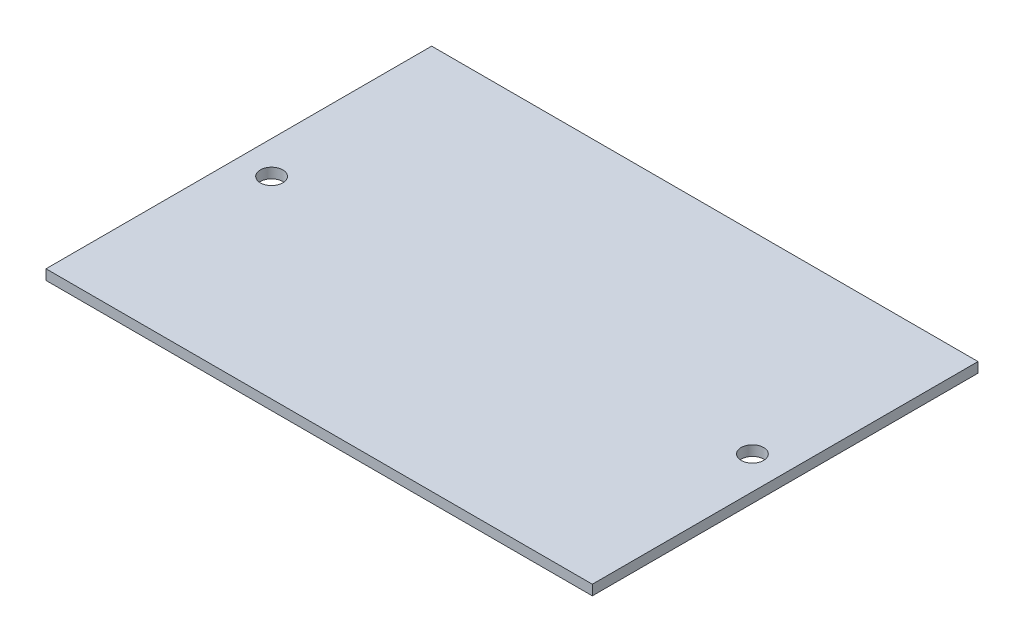
ISO-10303-21;
HEADER;
FILE_DESCRIPTION(('STEP AP214'),'2;1');
FILE_NAME('part.step','',(''),(''),'','','');
FILE_SCHEMA(('AUTOMOTIVE_DESIGN { 1 0 10303 214 1 1 1 1 }'));
ENDSEC;
DATA;
#1=APPLICATION_CONTEXT('core data for automotive mechanical design processes');
#2=APPLICATION_PROTOCOL_DEFINITION('international standard','automotive_design',2000,#1);
#3=PRODUCT_CONTEXT('',#1,'mechanical');
#4=PRODUCT('Part','Part','',(#3));
#5=PRODUCT_RELATED_PRODUCT_CATEGORY('part','',(#4));
#6=PRODUCT_DEFINITION_FORMATION('','',#4);
#7=PRODUCT_DEFINITION_CONTEXT('part definition',#1,'design');
#8=PRODUCT_DEFINITION('design','',#6,#7);
#9=PRODUCT_DEFINITION_SHAPE('','',#8);
#10=(LENGTH_UNIT() NAMED_UNIT(*) SI_UNIT(.MILLI.,.METRE.));
#11=(NAMED_UNIT(*) PLANE_ANGLE_UNIT() SI_UNIT($,.RADIAN.));
#12=(NAMED_UNIT(*) SI_UNIT($,.STERADIAN.) SOLID_ANGLE_UNIT());
#13=UNCERTAINTY_MEASURE_WITH_UNIT(LENGTH_MEASURE(1.E-05),#10,'distance_accuracy_value','');
#14=(GEOMETRIC_REPRESENTATION_CONTEXT(3) GLOBAL_UNCERTAINTY_ASSIGNED_CONTEXT((#13)) GLOBAL_UNIT_ASSIGNED_CONTEXT((#10,
#11,#12)) REPRESENTATION_CONTEXT('',''));
#15=CARTESIAN_POINT('',(0.,0.,0.));
#16=DIRECTION('',(0.,0.,1.));
#17=DIRECTION('',(1.,0.,0.));
#18=AXIS2_PLACEMENT_3D('',#15,#16,#17);
#19=CARTESIAN_POINT('',(43.18,1.6,-30.48));
#20=DIRECTION('',(-1.,0.,0.));
#21=DIRECTION('',(0.,0.,1.));
#22=AXIS2_PLACEMENT_3D('',#19,#20,#21);
#23=PLANE('',#22);
#24=DIRECTION('',(0.,0.,-1.));
#25=VECTOR('',#24,1.);
#26=CARTESIAN_POINT('',(43.18,0.,-30.48));
#27=LINE('',#26,#25);
#28=CARTESIAN_POINT('',(43.18,0.,30.48));
#29=VERTEX_POINT('',#28);
#30=CARTESIAN_POINT('',(43.18,0.,-30.48));
#31=VERTEX_POINT('',#30);
#32=EDGE_CURVE('E95',#29,#31,#27,.T.);
#33=ORIENTED_EDGE('',*,*,#32,.T.);
#34=DIRECTION('',(0.,-1.,0.));
#35=VECTOR('',#34,1.);
#36=CARTESIAN_POINT('',(43.18,1.6,-30.48));
#37=LINE('',#36,#35);
#38=CARTESIAN_POINT('',(43.18,1.6,-30.48));
#39=VERTEX_POINT('',#38);
#40=EDGE_CURVE('E11',#39,#31,#37,.T.);
#41=ORIENTED_EDGE('',*,*,#40,.F.);
#42=DIRECTION('',(0.,0.,-1.));
#43=VECTOR('',#42,1.);
#44=CARTESIAN_POINT('',(43.18,1.6,-30.48));
#45=LINE('',#44,#43);
#46=CARTESIAN_POINT('',(43.18,1.6,30.48));
#47=VERTEX_POINT('',#46);
#48=EDGE_CURVE('E83',#47,#39,#45,.T.);
#49=ORIENTED_EDGE('',*,*,#48,.F.);
#50=DIRECTION('',(0.,-1.,0.));
#51=VECTOR('',#50,1.);
#52=CARTESIAN_POINT('',(43.18,1.6,30.48));
#53=LINE('',#52,#51);
#54=EDGE_CURVE('E91',#47,#29,#53,.T.);
#55=ORIENTED_EDGE('',*,*,#54,.T.);
#56=EDGE_LOOP('',(#33,#41,#49,#55));
#57=FACE_BOUND('',#56,.T.);
#58=ADVANCED_FACE('F32',(#57),#23,.F.);
#59=CARTESIAN_POINT('',(-43.18,1.6,-30.48));
#60=DIRECTION('',(0.,0.,1.));
#61=DIRECTION('',(1.,0.,0.));
#62=AXIS2_PLACEMENT_3D('',#59,#60,#61);
#63=PLANE('',#62);
#64=DIRECTION('',(-1.,0.,0.));
#65=VECTOR('',#64,1.);
#66=CARTESIAN_POINT('',(-43.18,0.,-30.48));
#67=LINE('',#66,#65);
#68=CARTESIAN_POINT('',(-43.18,0.,-30.48));
#69=VERTEX_POINT('',#68);
#70=EDGE_CURVE('E87',#31,#69,#67,.T.);
#71=ORIENTED_EDGE('',*,*,#70,.T.);
#72=DIRECTION('',(0.,-1.,0.));
#73=VECTOR('',#72,1.);
#74=CARTESIAN_POINT('',(-43.18,1.6,-30.48));
#75=LINE('',#74,#73);
#76=CARTESIAN_POINT('',(-43.18,1.6,-30.48));
#77=VERTEX_POINT('',#76);
#78=EDGE_CURVE('E40',#77,#69,#75,.T.);
#79=ORIENTED_EDGE('',*,*,#78,.F.);
#80=DIRECTION('',(-1.,0.,0.));
#81=VECTOR('',#80,1.);
#82=CARTESIAN_POINT('',(-43.18,1.6,-30.48));
#83=LINE('',#82,#81);
#84=EDGE_CURVE('E78',#39,#77,#83,.T.);
#85=ORIENTED_EDGE('',*,*,#84,.F.);
#86=ORIENTED_EDGE('',*,*,#40,.T.);
#87=EDGE_LOOP('',(#71,#79,#85,#86));
#88=FACE_BOUND('',#87,.T.);
#89=ADVANCED_FACE('F86',(#88),#63,.F.);
#90=CARTESIAN_POINT('',(-43.18,1.6,-30.48));
#91=DIRECTION('',(1.,0.,0.));
#92=DIRECTION('',(0.,0.,-1.));
#93=AXIS2_PLACEMENT_3D('',#90,#91,#92);
#94=PLANE('',#93);
#95=DIRECTION('',(0.,0.,1.));
#96=VECTOR('',#95,1.);
#97=CARTESIAN_POINT('',(-43.18,0.,-30.48));
#98=LINE('',#97,#96);
#99=CARTESIAN_POINT('',(-43.18,0.,30.48));
#100=VERTEX_POINT('',#99);
#101=EDGE_CURVE('E65',#69,#100,#98,.T.);
#102=ORIENTED_EDGE('',*,*,#101,.T.);
#103=DIRECTION('',(0.,-1.,0.));
#104=VECTOR('',#103,1.);
#105=CARTESIAN_POINT('',(-43.18,1.6,30.48));
#106=LINE('',#105,#104);
#107=CARTESIAN_POINT('',(-43.18,1.6,30.48));
#108=VERTEX_POINT('',#107);
#109=EDGE_CURVE('E88',#108,#100,#106,.T.);
#110=ORIENTED_EDGE('',*,*,#109,.F.);
#111=DIRECTION('',(0.,0.,1.));
#112=VECTOR('',#111,1.);
#113=CARTESIAN_POINT('',(-43.18,1.6,-30.48));
#114=LINE('',#113,#112);
#115=EDGE_CURVE('E81',#77,#108,#114,.T.);
#116=ORIENTED_EDGE('',*,*,#115,.F.);
#117=ORIENTED_EDGE('',*,*,#78,.T.);
#118=EDGE_LOOP('',(#102,#110,#116,#117));
#119=FACE_BOUND('',#118,.T.);
#120=ADVANCED_FACE('F89',(#119),#94,.F.);
#121=CARTESIAN_POINT('',(-43.18,1.6,30.48));
#122=DIRECTION('',(0.,0.,-1.));
#123=DIRECTION('',(-1.,0.,0.));
#124=AXIS2_PLACEMENT_3D('',#121,#122,#123);
#125=PLANE('',#124);
#126=DIRECTION('',(1.,0.,0.));
#127=VECTOR('',#126,1.);
#128=CARTESIAN_POINT('',(-43.18,0.,30.48));
#129=LINE('',#128,#127);
#130=EDGE_CURVE('E71',#100,#29,#129,.T.);
#131=ORIENTED_EDGE('',*,*,#130,.T.);
#132=ORIENTED_EDGE('',*,*,#54,.F.);
#133=DIRECTION('',(1.,0.,0.));
#134=VECTOR('',#133,1.);
#135=CARTESIAN_POINT('',(-43.18,1.6,30.48));
#136=LINE('',#135,#134);
#137=EDGE_CURVE('E48',#108,#47,#136,.T.);
#138=ORIENTED_EDGE('',*,*,#137,.F.);
#139=ORIENTED_EDGE('',*,*,#109,.T.);
#140=EDGE_LOOP('',(#131,#132,#138,#139));
#141=FACE_BOUND('',#140,.T.);
#142=ADVANCED_FACE('F103',(#141),#125,.F.);
#143=CARTESIAN_POINT('',(0.,1.6,0.));
#144=DIRECTION('',(0.,1.,0.));
#145=DIRECTION('',(0.,0.,1.));
#146=AXIS2_PLACEMENT_3D('',#143,#144,#145);
#147=PLANE('',#146);
#148=CARTESIAN_POINT('',(-38.,1.6,0.));
#149=DIRECTION('',(0.,1.,0.));
#150=DIRECTION('',(0.,0.,1.));
#151=AXIS2_PLACEMENT_3D('',#148,#149,#150);
#152=CIRCLE('',#151,1.778);
#153=CARTESIAN_POINT('',(-38.,1.6,1.778));
#154=VERTEX_POINT('',#153);
#155=EDGE_CURVE('E112',#154,#154,#152,.T.);
#156=ORIENTED_EDGE('',*,*,#155,.F.);
#157=EDGE_LOOP('',(#156));
#158=FACE_BOUND('',#157,.T.);
#159=CARTESIAN_POINT('',(38.,1.6,0.));
#160=DIRECTION('',(0.,1.,0.));
#161=DIRECTION('',(0.,0.,1.));
#162=AXIS2_PLACEMENT_3D('',#159,#160,#161);
#163=CIRCLE('',#162,1.778);
#164=CARTESIAN_POINT('',(38.,1.6,1.77799999999999));
#165=VERTEX_POINT('',#164);
#166=EDGE_CURVE('E113',#165,#165,#163,.T.);
#167=ORIENTED_EDGE('',*,*,#166,.F.);
#168=EDGE_LOOP('',(#167));
#169=FACE_BOUND('',#168,.T.);
#170=ORIENTED_EDGE('',*,*,#48,.T.);
#171=ORIENTED_EDGE('',*,*,#84,.T.);
#172=ORIENTED_EDGE('',*,*,#115,.T.);
#173=ORIENTED_EDGE('',*,*,#137,.T.);
#174=EDGE_LOOP('',(#170,#171,#172,#173));
#175=FACE_BOUND('',#174,.T.);
#176=ADVANCED_FACE('F79',(#158,#169,#175),#147,.T.);
#177=CARTESIAN_POINT('',(0.,0.,0.));
#178=DIRECTION('',(0.,1.,0.));
#179=DIRECTION('',(0.,0.,1.));
#180=AXIS2_PLACEMENT_3D('',#177,#178,#179);
#181=PLANE('',#180);
#182=CARTESIAN_POINT('',(-38.,0.,0.));
#183=DIRECTION('',(0.,1.,0.));
#184=DIRECTION('',(0.,0.,1.));
#185=AXIS2_PLACEMENT_3D('',#182,#183,#184);
#186=CIRCLE('',#185,1.778);
#187=CARTESIAN_POINT('',(-38.,0.,1.778));
#188=VERTEX_POINT('',#187);
#189=EDGE_CURVE('E98',#188,#188,#186,.F.);
#190=ORIENTED_EDGE('',*,*,#189,.F.);
#191=EDGE_LOOP('',(#190));
#192=FACE_BOUND('',#191,.T.);
#193=CARTESIAN_POINT('',(38.,0.,0.));
#194=DIRECTION('',(0.,1.,0.));
#195=DIRECTION('',(0.,0.,1.));
#196=AXIS2_PLACEMENT_3D('',#193,#194,#195);
#197=CIRCLE('',#196,1.778);
#198=CARTESIAN_POINT('',(38.,0.,1.77799999999999));
#199=VERTEX_POINT('',#198);
#200=EDGE_CURVE('E109',#199,#199,#197,.F.);
#201=ORIENTED_EDGE('',*,*,#200,.F.);
#202=EDGE_LOOP('',(#201));
#203=FACE_BOUND('',#202,.T.);
#204=ORIENTED_EDGE('',*,*,#32,.F.);
#205=ORIENTED_EDGE('',*,*,#130,.F.);
#206=ORIENTED_EDGE('',*,*,#101,.F.);
#207=ORIENTED_EDGE('',*,*,#70,.F.);
#208=EDGE_LOOP('',(#204,#205,#206,#207));
#209=FACE_BOUND('',#208,.T.);
#210=ADVANCED_FACE('F106',(#192,#203,#209),#181,.F.);
#211=CARTESIAN_POINT('',(38.,-0.000999999999999916,0.));
#212=DIRECTION('',(0.,1.,0.));
#213=DIRECTION('',(0.,0.,1.));
#214=AXIS2_PLACEMENT_3D('',#211,#212,#213);
#215=CYLINDRICAL_SURFACE('',#214,1.778);
#216=ORIENTED_EDGE('',*,*,#166,.T.);
#217=EDGE_LOOP('',(#216));
#218=FACE_BOUND('',#217,.T.);
#219=ORIENTED_EDGE('',*,*,#200,.T.);
#220=EDGE_LOOP('',(#219));
#221=FACE_BOUND('',#220,.T.);
#222=ADVANCED_FACE('F129',(#218,#221),#215,.F.);
#223=CARTESIAN_POINT('',(-38.,-0.000999999999999916,0.));
#224=DIRECTION('',(0.,1.,0.));
#225=DIRECTION('',(0.,0.,1.));
#226=AXIS2_PLACEMENT_3D('',#223,#224,#225);
#227=CYLINDRICAL_SURFACE('',#226,1.778);
#228=ORIENTED_EDGE('',*,*,#155,.T.);
#229=EDGE_LOOP('',(#228));
#230=FACE_BOUND('',#229,.T.);
#231=ORIENTED_EDGE('',*,*,#189,.T.);
#232=EDGE_LOOP('',(#231));
#233=FACE_BOUND('',#232,.T.);
#234=ADVANCED_FACE('F121',(#230,#233),#227,.F.);
#235=CLOSED_SHELL('',(#58,#89,#120,#142,#176,#210,#222,#234));
#236=MANIFOLD_SOLID_BREP('B2',#235);
#237=ADVANCED_BREP_SHAPE_REPRESENTATION('',(#18,#236),#14);
#238=SHAPE_DEFINITION_REPRESENTATION(#9,#237);
ENDSEC;
END-ISO-10303-21;
